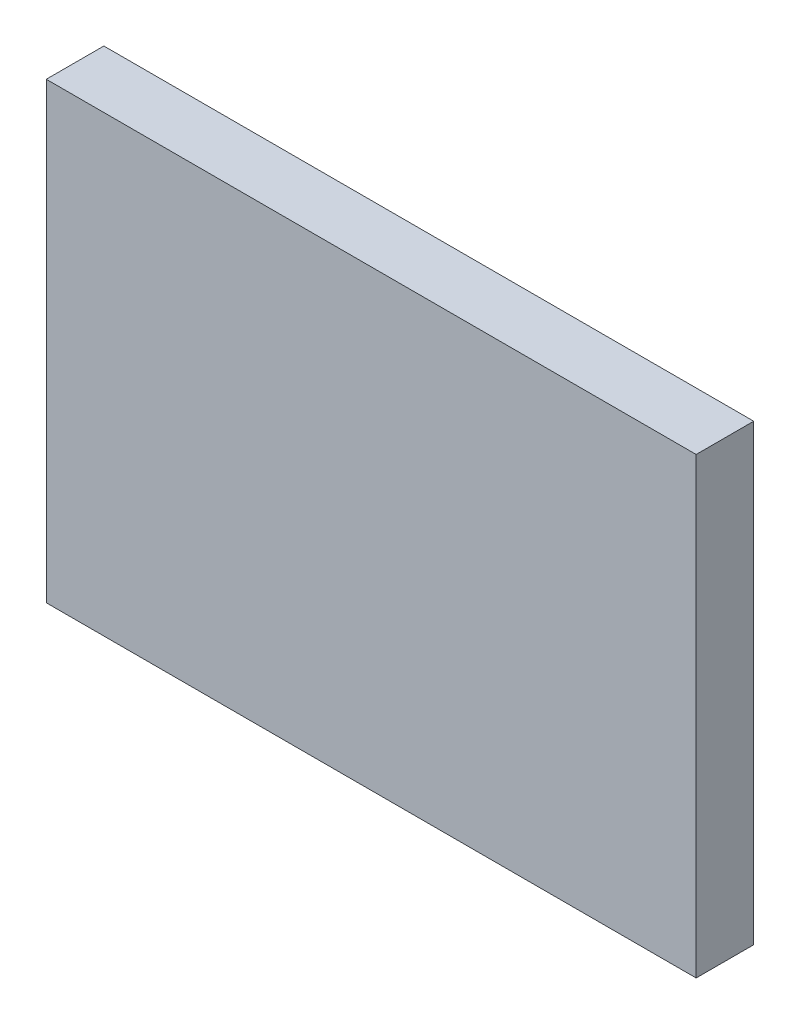
ISO-10303-21;
HEADER;
FILE_DESCRIPTION(('STEP AP214'),'2;1');
FILE_NAME('part.step','',(''),(''),'','','');
FILE_SCHEMA(('AUTOMOTIVE_DESIGN { 1 0 10303 214 1 1 1 1 }'));
ENDSEC;
DATA;
#1=APPLICATION_CONTEXT('core data for automotive mechanical design processes');
#2=APPLICATION_PROTOCOL_DEFINITION('international standard','automotive_design',2000,#1);
#3=PRODUCT_CONTEXT('',#1,'mechanical');
#4=PRODUCT('Part','Part','',(#3));
#5=PRODUCT_RELATED_PRODUCT_CATEGORY('part','',(#4));
#6=PRODUCT_DEFINITION_FORMATION('','',#4);
#7=PRODUCT_DEFINITION_CONTEXT('part definition',#1,'design');
#8=PRODUCT_DEFINITION('design','',#6,#7);
#9=PRODUCT_DEFINITION_SHAPE('','',#8);
#10=(LENGTH_UNIT() NAMED_UNIT(*) SI_UNIT(.MILLI.,.METRE.));
#11=(NAMED_UNIT(*) PLANE_ANGLE_UNIT() SI_UNIT($,.RADIAN.));
#12=(NAMED_UNIT(*) SI_UNIT($,.STERADIAN.) SOLID_ANGLE_UNIT());
#13=UNCERTAINTY_MEASURE_WITH_UNIT(LENGTH_MEASURE(1.E-05),#10,'distance_accuracy_value','');
#14=(GEOMETRIC_REPRESENTATION_CONTEXT(3) GLOBAL_UNCERTAINTY_ASSIGNED_CONTEXT((#13)) GLOBAL_UNIT_ASSIGNED_CONTEXT((#10,
#11,#12)) REPRESENTATION_CONTEXT('',''));
#15=CARTESIAN_POINT('',(0.,0.,0.));
#16=DIRECTION('',(0.,0.,1.));
#17=DIRECTION('',(1.,0.,0.));
#18=AXIS2_PLACEMENT_3D('',#15,#16,#17);
#19=CARTESIAN_POINT('',(-4.300012700025,-3.000025400051,0.762001524003));
#20=DIRECTION('',(0.,0.,1.));
#21=DIRECTION('',(1.,0.,0.));
#22=AXIS2_PLACEMENT_3D('',#19,#20,#21);
#23=PLANE('',#22);
#24=DIRECTION('',(0.,-1.,0.));
#25=VECTOR('',#24,1.);
#26=CARTESIAN_POINT('',(4.300012700025,-2.54000509999908E-05,0.762001524003));
#27=LINE('',#26,#25);
#28=CARTESIAN_POINT('',(4.300012700025,2.999974599949,0.762001524003));
#29=VERTEX_POINT('',#28);
#30=CARTESIAN_POINT('',(4.300012700025,-3.000025400051,0.762001524003));
#31=VERTEX_POINT('',#30);
#32=EDGE_CURVE('E77',#29,#31,#27,.T.);
#33=ORIENTED_EDGE('',*,*,#32,.F.);
#34=DIRECTION('',(1.,0.,0.));
#35=VECTOR('',#34,1.);
#36=CARTESIAN_POINT('',(0.,2.999974599949,0.762001524003));
#37=LINE('',#36,#35);
#38=CARTESIAN_POINT('',(-4.300012700025,2.999974599949,0.762001524003));
#39=VERTEX_POINT('',#38);
#40=EDGE_CURVE('E59',#39,#29,#37,.T.);
#41=ORIENTED_EDGE('',*,*,#40,.F.);
#42=DIRECTION('',(0.,-1.,0.));
#43=VECTOR('',#42,1.);
#44=CARTESIAN_POINT('',(-4.300012700025,-2.54000509999908E-05,0.762001524003));
#45=LINE('',#44,#43);
#46=CARTESIAN_POINT('',(-4.300012700025,-3.000025400051,0.762001524003));
#47=VERTEX_POINT('',#46);
#48=EDGE_CURVE('E21',#39,#47,#45,.T.);
#49=ORIENTED_EDGE('',*,*,#48,.T.);
#50=DIRECTION('',(1.,0.,0.));
#51=VECTOR('',#50,1.);
#52=CARTESIAN_POINT('',(0.,-3.000025400051,0.762001524003));
#53=LINE('',#52,#51);
#54=EDGE_CURVE('E56',#47,#31,#53,.T.);
#55=ORIENTED_EDGE('',*,*,#54,.T.);
#56=EDGE_LOOP('',(#33,#41,#49,#55));
#57=FACE_BOUND('',#56,.T.);
#58=ADVANCED_FACE('F17',(#57),#23,.T.);
#59=CARTESIAN_POINT('',(-4.300012700025,2.999974599949,0.));
#60=DIRECTION('',(1.,0.,0.));
#61=DIRECTION('',(0.,0.,1.));
#62=AXIS2_PLACEMENT_3D('',#59,#60,#61);
#63=PLANE('',#62);
#64=DIRECTION('',(0.,0.,1.));
#65=VECTOR('',#64,1.);
#66=CARTESIAN_POINT('',(-4.300012700025,2.999974599949,0.3810007620015));
#67=LINE('',#66,#65);
#68=CARTESIAN_POINT('',(-4.300012700025,2.999974599949,0.));
#69=VERTEX_POINT('',#68);
#70=EDGE_CURVE('E79',#69,#39,#67,.T.);
#71=ORIENTED_EDGE('',*,*,#70,.F.);
#72=DIRECTION('',(0.,-1.,0.));
#73=VECTOR('',#72,1.);
#74=CARTESIAN_POINT('',(-4.300012700025,-2.54000509999908E-05,0.));
#75=LINE('',#74,#73);
#76=CARTESIAN_POINT('',(-4.300012700025,-3.000025400051,0.));
#77=VERTEX_POINT('',#76);
#78=EDGE_CURVE('E74',#69,#77,#75,.T.);
#79=ORIENTED_EDGE('',*,*,#78,.T.);
#80=DIRECTION('',(0.,0.,1.));
#81=VECTOR('',#80,1.);
#82=CARTESIAN_POINT('',(-4.300012700025,-3.000025400051,0.3810007620015));
#83=LINE('',#82,#81);
#84=EDGE_CURVE('E64',#77,#47,#83,.T.);
#85=ORIENTED_EDGE('',*,*,#84,.T.);
#86=ORIENTED_EDGE('',*,*,#48,.F.);
#87=EDGE_LOOP('',(#71,#79,#85,#86));
#88=FACE_BOUND('',#87,.T.);
#89=ADVANCED_FACE('F73',(#88),#63,.F.);
#90=CARTESIAN_POINT('',(-4.300012700025,-3.000025400051,0.));
#91=DIRECTION('',(0.,1.,0.));
#92=DIRECTION('',(0.,0.,1.));
#93=AXIS2_PLACEMENT_3D('',#90,#91,#92);
#94=PLANE('',#93);
#95=ORIENTED_EDGE('',*,*,#54,.F.);
#96=ORIENTED_EDGE('',*,*,#84,.F.);
#97=DIRECTION('',(1.,0.,0.));
#98=VECTOR('',#97,1.);
#99=CARTESIAN_POINT('',(0.,-3.000025400051,0.));
#100=LINE('',#99,#98);
#101=CARTESIAN_POINT('',(4.300012700025,-3.000025400051,0.));
#102=VERTEX_POINT('',#101);
#103=EDGE_CURVE('E84',#77,#102,#100,.T.);
#104=ORIENTED_EDGE('',*,*,#103,.T.);
#105=DIRECTION('',(0.,0.,-1.));
#106=VECTOR('',#105,1.);
#107=CARTESIAN_POINT('',(4.300012700025,-3.000025400051,0.3810007620015));
#108=LINE('',#107,#106);
#109=EDGE_CURVE('E70',#31,#102,#108,.T.);
#110=ORIENTED_EDGE('',*,*,#109,.F.);
#111=EDGE_LOOP('',(#95,#96,#104,#110));
#112=FACE_BOUND('',#111,.T.);
#113=ADVANCED_FACE('F67',(#112),#94,.F.);
#114=CARTESIAN_POINT('',(4.300012700025,2.999974599949,0.));
#115=DIRECTION('',(1.,0.,0.));
#116=DIRECTION('',(0.,0.,1.));
#117=AXIS2_PLACEMENT_3D('',#114,#115,#116);
#118=PLANE('',#117);
#119=DIRECTION('',(0.,0.,-1.));
#120=VECTOR('',#119,1.);
#121=CARTESIAN_POINT('',(4.300012700025,2.999974599949,0.3810007620015));
#122=LINE('',#121,#120);
#123=CARTESIAN_POINT('',(4.300012700025,2.999974599949,0.));
#124=VERTEX_POINT('',#123);
#125=EDGE_CURVE('E35',#29,#124,#122,.T.);
#126=ORIENTED_EDGE('',*,*,#125,.F.);
#127=ORIENTED_EDGE('',*,*,#32,.T.);
#128=ORIENTED_EDGE('',*,*,#109,.T.);
#129=DIRECTION('',(0.,1.,0.));
#130=VECTOR('',#129,1.);
#131=CARTESIAN_POINT('',(4.300012700025,-2.54000509999908E-05,0.));
#132=LINE('',#131,#130);
#133=EDGE_CURVE('E27',#102,#124,#132,.T.);
#134=ORIENTED_EDGE('',*,*,#133,.T.);
#135=EDGE_LOOP('',(#126,#127,#128,#134));
#136=FACE_BOUND('',#135,.T.);
#137=ADVANCED_FACE('F89',(#136),#118,.T.);
#138=CARTESIAN_POINT('',(-4.300012700025,2.999974599949,0.));
#139=DIRECTION('',(0.,1.,0.));
#140=DIRECTION('',(0.,0.,1.));
#141=AXIS2_PLACEMENT_3D('',#138,#139,#140);
#142=PLANE('',#141);
#143=ORIENTED_EDGE('',*,*,#40,.T.);
#144=ORIENTED_EDGE('',*,*,#125,.T.);
#145=DIRECTION('',(-1.,0.,0.));
#146=VECTOR('',#145,1.);
#147=CARTESIAN_POINT('',(0.,2.999974599949,0.));
#148=LINE('',#147,#146);
#149=EDGE_CURVE('E11',#124,#69,#148,.T.);
#150=ORIENTED_EDGE('',*,*,#149,.T.);
#151=ORIENTED_EDGE('',*,*,#70,.T.);
#152=EDGE_LOOP('',(#143,#144,#150,#151));
#153=FACE_BOUND('',#152,.T.);
#154=ADVANCED_FACE('F91',(#153),#142,.T.);
#155=CARTESIAN_POINT('',(-4.300012700025,-3.000025400051,0.));
#156=DIRECTION('',(0.,0.,1.));
#157=DIRECTION('',(1.,0.,0.));
#158=AXIS2_PLACEMENT_3D('',#155,#156,#157);
#159=PLANE('',#158);
#160=ORIENTED_EDGE('',*,*,#133,.F.);
#161=ORIENTED_EDGE('',*,*,#103,.F.);
#162=ORIENTED_EDGE('',*,*,#78,.F.);
#163=ORIENTED_EDGE('',*,*,#149,.F.);
#164=EDGE_LOOP('',(#160,#161,#162,#163));
#165=FACE_BOUND('',#164,.T.);
#166=ADVANCED_FACE('F19',(#165),#159,.F.);
#167=CLOSED_SHELL('',(#58,#89,#113,#137,#154,#166));
#168=MANIFOLD_SOLID_BREP('B1',#167);
#169=ADVANCED_BREP_SHAPE_REPRESENTATION('',(#18,#168),#14);
#170=SHAPE_DEFINITION_REPRESENTATION(#9,#169);
ENDSEC;
END-ISO-10303-21;
